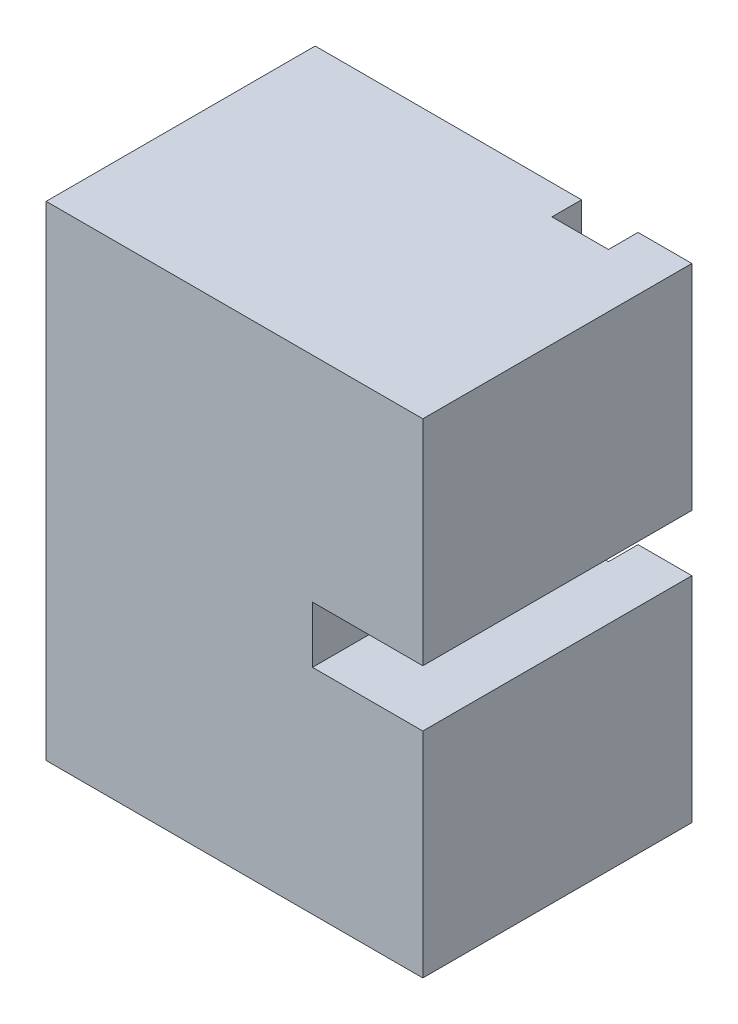
ISO-10303-21;
HEADER;
FILE_DESCRIPTION(('STEP AP214'),'2;1');
FILE_NAME('part.step','',(''),(''),'','','');
FILE_SCHEMA(('AUTOMOTIVE_DESIGN { 1 0 10303 214 1 1 1 1 }'));
ENDSEC;
DATA;
#1=APPLICATION_CONTEXT('core data for automotive mechanical design processes');
#2=APPLICATION_PROTOCOL_DEFINITION('international standard','automotive_design',2000,#1);
#3=PRODUCT_CONTEXT('',#1,'mechanical');
#4=PRODUCT('Part','Part','',(#3));
#5=PRODUCT_RELATED_PRODUCT_CATEGORY('part','',(#4));
#6=PRODUCT_DEFINITION_FORMATION('','',#4);
#7=PRODUCT_DEFINITION_CONTEXT('part definition',#1,'design');
#8=PRODUCT_DEFINITION('design','',#6,#7);
#9=PRODUCT_DEFINITION_SHAPE('','',#8);
#10=(LENGTH_UNIT() NAMED_UNIT(*) SI_UNIT(.MILLI.,.METRE.));
#11=(NAMED_UNIT(*) PLANE_ANGLE_UNIT() SI_UNIT($,.RADIAN.));
#12=(NAMED_UNIT(*) SI_UNIT($,.STERADIAN.) SOLID_ANGLE_UNIT());
#13=UNCERTAINTY_MEASURE_WITH_UNIT(LENGTH_MEASURE(1.E-05),#10,'distance_accuracy_value','');
#14=(GEOMETRIC_REPRESENTATION_CONTEXT(3) GLOBAL_UNCERTAINTY_ASSIGNED_CONTEXT((#13)) GLOBAL_UNIT_ASSIGNED_CONTEXT((#10,
#11,#12)) REPRESENTATION_CONTEXT('',''));
#15=CARTESIAN_POINT('',(0.,0.,0.));
#16=DIRECTION('',(0.,0.,1.));
#17=DIRECTION('',(1.,0.,0.));
#18=AXIS2_PLACEMENT_3D('',#15,#16,#17);
#19=CARTESIAN_POINT('',(0.,0.,50.));
#20=DIRECTION('',(0.,1.,0.));
#21=DIRECTION('',(0.,0.,1.));
#22=AXIS2_PLACEMENT_3D('',#19,#20,#21);
#23=PLANE('',#22);
#24=DIRECTION('',(0.,0.,-1.));
#25=VECTOR('',#24,1.);
#26=CARTESIAN_POINT('',(49.5,0.,50.));
#27=LINE('',#26,#25);
#28=CARTESIAN_POINT('',(49.5,0.,5.5));
#29=VERTEX_POINT('',#28);
#30=CARTESIAN_POINT('',(49.5,0.,0.));
#31=VERTEX_POINT('',#30);
#32=EDGE_CURVE('E153',#29,#31,#27,.T.);
#33=ORIENTED_EDGE('',*,*,#32,.F.);
#34=DIRECTION('',(-1.,0.,0.));
#35=VECTOR('',#34,1.);
#36=CARTESIAN_POINT('',(0.,0.,5.5));
#37=LINE('',#36,#35);
#38=CARTESIAN_POINT('',(60.,0.,5.5));
#39=VERTEX_POINT('',#38);
#40=EDGE_CURVE('E147',#39,#29,#37,.T.);
#41=ORIENTED_EDGE('',*,*,#40,.F.);
#42=DIRECTION('',(0.,0.,1.));
#43=VECTOR('',#42,1.);
#44=CARTESIAN_POINT('',(60.,0.,50.));
#45=LINE('',#44,#43);
#46=CARTESIAN_POINT('',(60.,0.,0.));
#47=VERTEX_POINT('',#46);
#48=EDGE_CURVE('E133',#47,#39,#45,.T.);
#49=ORIENTED_EDGE('',*,*,#48,.F.);
#50=DIRECTION('',(1.,0.,0.));
#51=VECTOR('',#50,1.);
#52=CARTESIAN_POINT('',(0.,0.,0.));
#53=LINE('',#52,#51);
#54=CARTESIAN_POINT('',(70.,0.,0.));
#55=VERTEX_POINT('',#54);
#56=EDGE_CURVE('E208',#47,#55,#53,.T.);
#57=ORIENTED_EDGE('',*,*,#56,.T.);
#58=DIRECTION('',(0.,0.,-1.));
#59=VECTOR('',#58,1.);
#60=CARTESIAN_POINT('',(70.,0.,50.));
#61=LINE('',#60,#59);
#62=CARTESIAN_POINT('',(70.,0.,50.));
#63=VERTEX_POINT('',#62);
#64=EDGE_CURVE('E223',#63,#55,#61,.T.);
#65=ORIENTED_EDGE('',*,*,#64,.F.);
#66=DIRECTION('',(1.,0.,0.));
#67=VECTOR('',#66,1.);
#68=CARTESIAN_POINT('',(0.,0.,50.));
#69=LINE('',#68,#67);
#70=CARTESIAN_POINT('',(0.,0.,50.));
#71=VERTEX_POINT('',#70);
#72=EDGE_CURVE('E196',#71,#63,#69,.T.);
#73=ORIENTED_EDGE('',*,*,#72,.F.);
#74=DIRECTION('',(0.,0.,-1.));
#75=VECTOR('',#74,1.);
#76=CARTESIAN_POINT('',(0.,0.,50.));
#77=LINE('',#76,#75);
#78=CARTESIAN_POINT('',(0.,0.,0.));
#79=VERTEX_POINT('',#78);
#80=EDGE_CURVE('E226',#71,#79,#77,.T.);
#81=ORIENTED_EDGE('',*,*,#80,.T.);
#82=EDGE_CURVE('E209',#79,#31,#53,.T.);
#83=ORIENTED_EDGE('',*,*,#82,.T.);
#84=EDGE_LOOP('',(#33,#41,#49,#57,#65,#73,#81,#83));
#85=FACE_BOUND('',#84,.T.);
#86=ADVANCED_FACE('F33',(#85),#23,.F.);
#87=CARTESIAN_POINT('',(0.,90.,50.));
#88=DIRECTION('',(0.,-1.,0.));
#89=DIRECTION('',(0.,0.,-1.));
#90=AXIS2_PLACEMENT_3D('',#87,#88,#89);
#91=PLANE('',#90);
#92=DIRECTION('',(0.,0.,1.));
#93=VECTOR('',#92,1.);
#94=CARTESIAN_POINT('',(49.5,90.,50.));
#95=LINE('',#94,#93);
#96=CARTESIAN_POINT('',(49.5,90.,0.));
#97=VERTEX_POINT('',#96);
#98=CARTESIAN_POINT('',(49.5,90.,5.5));
#99=VERTEX_POINT('',#98);
#100=EDGE_CURVE('E143',#97,#99,#95,.T.);
#101=ORIENTED_EDGE('',*,*,#100,.F.);
#102=DIRECTION('',(-1.,0.,0.));
#103=VECTOR('',#102,1.);
#104=CARTESIAN_POINT('',(0.,90.,0.));
#105=LINE('',#104,#103);
#106=CARTESIAN_POINT('',(0.,90.,0.));
#107=VERTEX_POINT('',#106);
#108=EDGE_CURVE('E215',#97,#107,#105,.T.);
#109=ORIENTED_EDGE('',*,*,#108,.T.);
#110=DIRECTION('',(0.,0.,-1.));
#111=VECTOR('',#110,1.);
#112=CARTESIAN_POINT('',(0.,90.,50.));
#113=LINE('',#112,#111);
#114=CARTESIAN_POINT('',(0.,90.,50.));
#115=VERTEX_POINT('',#114);
#116=EDGE_CURVE('E205',#115,#107,#113,.T.);
#117=ORIENTED_EDGE('',*,*,#116,.F.);
#118=DIRECTION('',(-1.,0.,0.));
#119=VECTOR('',#118,1.);
#120=CARTESIAN_POINT('',(0.,90.,50.));
#121=LINE('',#120,#119);
#122=CARTESIAN_POINT('',(70.,90.,50.));
#123=VERTEX_POINT('',#122);
#124=EDGE_CURVE('E203',#123,#115,#121,.T.);
#125=ORIENTED_EDGE('',*,*,#124,.F.);
#126=DIRECTION('',(0.,0.,-1.));
#127=VECTOR('',#126,1.);
#128=CARTESIAN_POINT('',(70.,90.,50.));
#129=LINE('',#128,#127);
#130=CARTESIAN_POINT('',(70.,90.,0.));
#131=VERTEX_POINT('',#130);
#132=EDGE_CURVE('E220',#123,#131,#129,.T.);
#133=ORIENTED_EDGE('',*,*,#132,.T.);
#134=CARTESIAN_POINT('',(60.,90.,0.));
#135=VERTEX_POINT('',#134);
#136=EDGE_CURVE('E197',#131,#135,#105,.T.);
#137=ORIENTED_EDGE('',*,*,#136,.T.);
#138=DIRECTION('',(0.,0.,-1.));
#139=VECTOR('',#138,1.);
#140=CARTESIAN_POINT('',(60.,90.,50.));
#141=LINE('',#140,#139);
#142=CARTESIAN_POINT('',(60.,90.,5.5));
#143=VERTEX_POINT('',#142);
#144=EDGE_CURVE('E144',#143,#135,#141,.T.);
#145=ORIENTED_EDGE('',*,*,#144,.F.);
#146=DIRECTION('',(1.,0.,0.));
#147=VECTOR('',#146,1.);
#148=CARTESIAN_POINT('',(0.,90.,5.5));
#149=LINE('',#148,#147);
#150=EDGE_CURVE('E155',#99,#143,#149,.T.);
#151=ORIENTED_EDGE('',*,*,#150,.F.);
#152=EDGE_LOOP('',(#101,#109,#117,#125,#133,#137,#145,#151));
#153=FACE_BOUND('',#152,.T.);
#154=ADVANCED_FACE('F264',(#153),#91,.F.);
#155=CARTESIAN_POINT('',(0.,0.,0.));
#156=DIRECTION('',(0.,0.,-1.));
#157=DIRECTION('',(-1.,0.,0.));
#158=AXIS2_PLACEMENT_3D('',#155,#156,#157);
#159=PLANE('',#158);
#160=ORIENTED_EDGE('',*,*,#108,.F.);
#161=DIRECTION('',(0.,1.,0.));
#162=VECTOR('',#161,1.);
#163=CARTESIAN_POINT('',(49.5,50.25,0.));
#164=LINE('',#163,#162);
#165=EDGE_CURVE('E179',#31,#97,#164,.T.);
#166=ORIENTED_EDGE('',*,*,#165,.F.);
#167=ORIENTED_EDGE('',*,*,#82,.F.);
#168=DIRECTION('',(0.,-1.,0.));
#169=VECTOR('',#168,1.);
#170=CARTESIAN_POINT('',(0.,0.,0.));
#171=LINE('',#170,#169);
#172=EDGE_CURVE('E185',#107,#79,#171,.T.);
#173=ORIENTED_EDGE('',*,*,#172,.F.);
#174=EDGE_LOOP('',(#160,#166,#167,#173));
#175=FACE_BOUND('',#174,.T.);
#176=ADVANCED_FACE('F236',(#175),#159,.T.);
#177=ORIENTED_EDGE('',*,*,#56,.F.);
#178=DIRECTION('',(0.,1.,0.));
#179=VECTOR('',#178,1.);
#180=CARTESIAN_POINT('',(60.,-9.75,0.));
#181=LINE('',#180,#179);
#182=CARTESIAN_POINT('',(60.,39.75,0.));
#183=VERTEX_POINT('',#182);
#184=EDGE_CURVE('E139',#47,#183,#181,.T.);
#185=ORIENTED_EDGE('',*,*,#184,.T.);
#186=DIRECTION('',(-1.,0.,0.));
#187=VECTOR('',#186,1.);
#188=CARTESIAN_POINT('',(70.,39.75,0.));
#189=LINE('',#188,#187);
#190=CARTESIAN_POINT('',(70.,39.75,0.));
#191=VERTEX_POINT('',#190);
#192=EDGE_CURVE('E165',#191,#183,#189,.T.);
#193=ORIENTED_EDGE('',*,*,#192,.F.);
#194=DIRECTION('',(0.,1.,0.));
#195=VECTOR('',#194,1.);
#196=CARTESIAN_POINT('',(70.,0.,0.));
#197=LINE('',#196,#195);
#198=EDGE_CURVE('E212',#55,#191,#197,.T.);
#199=ORIENTED_EDGE('',*,*,#198,.F.);
#200=EDGE_LOOP('',(#177,#185,#193,#199));
#201=FACE_BOUND('',#200,.T.);
#202=ADVANCED_FACE('F250',(#201),#159,.T.);
#203=DIRECTION('',(1.,0.,0.));
#204=VECTOR('',#203,1.);
#205=CARTESIAN_POINT('',(70.,50.25,0.));
#206=LINE('',#205,#204);
#207=CARTESIAN_POINT('',(60.,50.25,0.));
#208=VERTEX_POINT('',#207);
#209=CARTESIAN_POINT('',(70.,50.25,0.));
#210=VERTEX_POINT('',#209);
#211=EDGE_CURVE('E170',#208,#210,#206,.T.);
#212=ORIENTED_EDGE('',*,*,#211,.F.);
#213=EDGE_CURVE('E148',#208,#135,#181,.T.);
#214=ORIENTED_EDGE('',*,*,#213,.T.);
#215=ORIENTED_EDGE('',*,*,#136,.F.);
#216=EDGE_CURVE('E211',#210,#131,#197,.T.);
#217=ORIENTED_EDGE('',*,*,#216,.F.);
#218=EDGE_LOOP('',(#212,#214,#215,#217));
#219=FACE_BOUND('',#218,.T.);
#220=ADVANCED_FACE('F275',(#219),#159,.T.);
#221=CARTESIAN_POINT('',(70.,50.25,50.));
#222=DIRECTION('',(0.,1.,0.));
#223=DIRECTION('',(0.,0.,1.));
#224=AXIS2_PLACEMENT_3D('',#221,#222,#223);
#225=PLANE('',#224);
#226=DIRECTION('',(0.,0.,1.));
#227=VECTOR('',#226,1.);
#228=CARTESIAN_POINT('',(60.,50.25,50.));
#229=LINE('',#228,#227);
#230=CARTESIAN_POINT('',(60.,50.25,5.5));
#231=VERTEX_POINT('',#230);
#232=EDGE_CURVE('E154',#208,#231,#229,.T.);
#233=ORIENTED_EDGE('',*,*,#232,.F.);
#234=ORIENTED_EDGE('',*,*,#211,.T.);
#235=DIRECTION('',(0.,0.,-1.));
#236=VECTOR('',#235,1.);
#237=CARTESIAN_POINT('',(70.,50.25,50.));
#238=LINE('',#237,#236);
#239=CARTESIAN_POINT('',(70.,50.25,50.));
#240=VERTEX_POINT('',#239);
#241=EDGE_CURVE('E182',#240,#210,#238,.T.);
#242=ORIENTED_EDGE('',*,*,#241,.F.);
#243=DIRECTION('',(1.,0.,0.));
#244=VECTOR('',#243,1.);
#245=CARTESIAN_POINT('',(70.,50.25,50.));
#246=LINE('',#245,#244);
#247=CARTESIAN_POINT('',(49.5,50.25,50.));
#248=VERTEX_POINT('',#247);
#249=EDGE_CURVE('E173',#248,#240,#246,.T.);
#250=ORIENTED_EDGE('',*,*,#249,.F.);
#251=DIRECTION('',(0.,0.,-1.));
#252=VECTOR('',#251,1.);
#253=CARTESIAN_POINT('',(49.5,50.25,50.));
#254=LINE('',#253,#252);
#255=CARTESIAN_POINT('',(49.5,50.25,5.5));
#256=VERTEX_POINT('',#255);
#257=EDGE_CURVE('E186',#248,#256,#254,.T.);
#258=ORIENTED_EDGE('',*,*,#257,.T.);
#259=DIRECTION('',(-1.,0.,0.));
#260=VECTOR('',#259,1.);
#261=CARTESIAN_POINT('',(70.,50.25,5.5));
#262=LINE('',#261,#260);
#263=EDGE_CURVE('E158',#231,#256,#262,.T.);
#264=ORIENTED_EDGE('',*,*,#263,.F.);
#265=EDGE_LOOP('',(#233,#234,#242,#250,#258,#264));
#266=FACE_BOUND('',#265,.T.);
#267=ADVANCED_FACE('F277',(#266),#225,.F.);
#268=CARTESIAN_POINT('',(70.,39.75,50.));
#269=DIRECTION('',(0.,-1.,0.));
#270=DIRECTION('',(0.,0.,-1.));
#271=AXIS2_PLACEMENT_3D('',#268,#269,#270);
#272=PLANE('',#271);
#273=DIRECTION('',(0.,0.,-1.));
#274=VECTOR('',#273,1.);
#275=CARTESIAN_POINT('',(60.,39.75,50.));
#276=LINE('',#275,#274);
#277=CARTESIAN_POINT('',(60.,39.75,5.5));
#278=VERTEX_POINT('',#277);
#279=EDGE_CURVE('E11',#278,#183,#276,.T.);
#280=ORIENTED_EDGE('',*,*,#279,.F.);
#281=DIRECTION('',(1.,0.,0.));
#282=VECTOR('',#281,1.);
#283=CARTESIAN_POINT('',(70.,39.75,5.5));
#284=LINE('',#283,#282);
#285=CARTESIAN_POINT('',(49.5,39.75,5.5));
#286=VERTEX_POINT('',#285);
#287=EDGE_CURVE('E41',#286,#278,#284,.T.);
#288=ORIENTED_EDGE('',*,*,#287,.F.);
#289=DIRECTION('',(0.,0.,-1.));
#290=VECTOR('',#289,1.);
#291=CARTESIAN_POINT('',(49.5,39.75,50.));
#292=LINE('',#291,#290);
#293=CARTESIAN_POINT('',(49.5,39.75,50.));
#294=VERTEX_POINT('',#293);
#295=EDGE_CURVE('E189',#294,#286,#292,.T.);
#296=ORIENTED_EDGE('',*,*,#295,.F.);
#297=DIRECTION('',(-1.,0.,0.));
#298=VECTOR('',#297,1.);
#299=CARTESIAN_POINT('',(70.,39.75,50.));
#300=LINE('',#299,#298);
#301=CARTESIAN_POINT('',(70.,39.75,50.));
#302=VERTEX_POINT('',#301);
#303=EDGE_CURVE('E166',#302,#294,#300,.T.);
#304=ORIENTED_EDGE('',*,*,#303,.F.);
#305=DIRECTION('',(0.,0.,-1.));
#306=VECTOR('',#305,1.);
#307=CARTESIAN_POINT('',(70.,39.75,50.));
#308=LINE('',#307,#306);
#309=EDGE_CURVE('E176',#302,#191,#308,.T.);
#310=ORIENTED_EDGE('',*,*,#309,.T.);
#311=ORIENTED_EDGE('',*,*,#192,.T.);
#312=EDGE_LOOP('',(#280,#288,#296,#304,#310,#311));
#313=FACE_BOUND('',#312,.T.);
#314=ADVANCED_FACE('F253',(#313),#272,.F.);
#315=CARTESIAN_POINT('',(70.,0.,50.));
#316=DIRECTION('',(-1.,0.,0.));
#317=DIRECTION('',(0.,0.,1.));
#318=AXIS2_PLACEMENT_3D('',#315,#316,#317);
#319=PLANE('',#318);
#320=DIRECTION('',(0.,1.,0.));
#321=VECTOR('',#320,1.);
#322=CARTESIAN_POINT('',(70.,0.,50.));
#323=LINE('',#322,#321);
#324=EDGE_CURVE('E199',#240,#123,#323,.T.);
#325=ORIENTED_EDGE('',*,*,#324,.F.);
#326=ORIENTED_EDGE('',*,*,#241,.T.);
#327=ORIENTED_EDGE('',*,*,#216,.T.);
#328=ORIENTED_EDGE('',*,*,#132,.F.);
#329=EDGE_LOOP('',(#325,#326,#327,#328));
#330=FACE_BOUND('',#329,.T.);
#331=ADVANCED_FACE('F280',(#330),#319,.F.);
#332=CARTESIAN_POINT('',(0.,0.,50.));
#333=DIRECTION('',(1.,0.,0.));
#334=DIRECTION('',(0.,0.,-1.));
#335=AXIS2_PLACEMENT_3D('',#332,#333,#334);
#336=PLANE('',#335);
#337=ORIENTED_EDGE('',*,*,#172,.T.);
#338=ORIENTED_EDGE('',*,*,#80,.F.);
#339=DIRECTION('',(0.,-1.,0.));
#340=VECTOR('',#339,1.);
#341=CARTESIAN_POINT('',(0.,0.,50.));
#342=LINE('',#341,#340);
#343=EDGE_CURVE('E193',#115,#71,#342,.T.);
#344=ORIENTED_EDGE('',*,*,#343,.F.);
#345=ORIENTED_EDGE('',*,*,#116,.T.);
#346=EDGE_LOOP('',(#337,#338,#344,#345));
#347=FACE_BOUND('',#346,.T.);
#348=ADVANCED_FACE('F35',(#347),#336,.F.);
#349=ORIENTED_EDGE('',*,*,#198,.T.);
#350=ORIENTED_EDGE('',*,*,#309,.F.);
#351=EDGE_CURVE('E200',#63,#302,#323,.T.);
#352=ORIENTED_EDGE('',*,*,#351,.F.);
#353=ORIENTED_EDGE('',*,*,#64,.T.);
#354=EDGE_LOOP('',(#349,#350,#352,#353));
#355=FACE_BOUND('',#354,.T.);
#356=ADVANCED_FACE('F257',(#355),#319,.F.);
#357=CARTESIAN_POINT('',(0.,0.,50.));
#358=DIRECTION('',(0.,0.,-1.));
#359=DIRECTION('',(-1.,0.,0.));
#360=AXIS2_PLACEMENT_3D('',#357,#358,#359);
#361=PLANE('',#360);
#362=DIRECTION('',(0.,1.,0.));
#363=VECTOR('',#362,1.);
#364=CARTESIAN_POINT('',(49.5,50.25,50.));
#365=LINE('',#364,#363);
#366=EDGE_CURVE('E169',#294,#248,#365,.T.);
#367=ORIENTED_EDGE('',*,*,#366,.T.);
#368=ORIENTED_EDGE('',*,*,#249,.T.);
#369=ORIENTED_EDGE('',*,*,#324,.T.);
#370=ORIENTED_EDGE('',*,*,#124,.T.);
#371=ORIENTED_EDGE('',*,*,#343,.T.);
#372=ORIENTED_EDGE('',*,*,#72,.T.);
#373=ORIENTED_EDGE('',*,*,#351,.T.);
#374=ORIENTED_EDGE('',*,*,#303,.T.);
#375=EDGE_LOOP('',(#367,#368,#369,#370,#371,#372,#373,#374));
#376=FACE_BOUND('',#375,.T.);
#377=ADVANCED_FACE('F259',(#376),#361,.F.);
#378=CARTESIAN_POINT('',(49.5,50.25,50.));
#379=DIRECTION('',(-1.,0.,0.));
#380=DIRECTION('',(0.,0.,1.));
#381=AXIS2_PLACEMENT_3D('',#378,#379,#380);
#382=PLANE('',#381);
#383=ORIENTED_EDGE('',*,*,#165,.T.);
#384=ORIENTED_EDGE('',*,*,#100,.T.);
#385=DIRECTION('',(0.,1.,0.));
#386=VECTOR('',#385,1.);
#387=CARTESIAN_POINT('',(49.5,-9.75,5.5));
#388=LINE('',#387,#386);
#389=EDGE_CURVE('E241',#256,#99,#388,.T.);
#390=ORIENTED_EDGE('',*,*,#389,.F.);
#391=ORIENTED_EDGE('',*,*,#257,.F.);
#392=ORIENTED_EDGE('',*,*,#366,.F.);
#393=ORIENTED_EDGE('',*,*,#295,.T.);
#394=EDGE_CURVE('E56',#29,#286,#388,.T.);
#395=ORIENTED_EDGE('',*,*,#394,.F.);
#396=ORIENTED_EDGE('',*,*,#32,.T.);
#397=EDGE_LOOP('',(#383,#384,#390,#391,#392,#393,#395,#396));
#398=FACE_BOUND('',#397,.T.);
#399=ADVANCED_FACE('F239',(#398),#382,.F.);
#400=CARTESIAN_POINT('',(49.5,-9.75,5.5));
#401=DIRECTION('',(0.,0.,-1.));
#402=DIRECTION('',(-1.,0.,0.));
#403=AXIS2_PLACEMENT_3D('',#400,#401,#402);
#404=PLANE('',#403);
#405=ORIENTED_EDGE('',*,*,#40,.T.);
#406=ORIENTED_EDGE('',*,*,#394,.T.);
#407=ORIENTED_EDGE('',*,*,#287,.T.);
#408=DIRECTION('',(0.,1.,0.));
#409=VECTOR('',#408,1.);
#410=CARTESIAN_POINT('',(60.,-9.75,5.5));
#411=LINE('',#410,#409);
#412=EDGE_CURVE('E136',#39,#278,#411,.T.);
#413=ORIENTED_EDGE('',*,*,#412,.F.);
#414=EDGE_LOOP('',(#405,#406,#407,#413));
#415=FACE_BOUND('',#414,.T.);
#416=ADVANCED_FACE('F146',(#415),#404,.T.);
#417=CARTESIAN_POINT('',(60.,-9.75,0.));
#418=DIRECTION('',(-1.,0.,0.));
#419=DIRECTION('',(0.,0.,1.));
#420=AXIS2_PLACEMENT_3D('',#417,#418,#419);
#421=PLANE('',#420);
#422=ORIENTED_EDGE('',*,*,#48,.T.);
#423=ORIENTED_EDGE('',*,*,#412,.T.);
#424=ORIENTED_EDGE('',*,*,#279,.T.);
#425=ORIENTED_EDGE('',*,*,#184,.F.);
#426=EDGE_LOOP('',(#422,#423,#424,#425));
#427=FACE_BOUND('',#426,.T.);
#428=ADVANCED_FACE('F135',(#427),#421,.T.);
#429=ORIENTED_EDGE('',*,*,#144,.T.);
#430=ORIENTED_EDGE('',*,*,#213,.F.);
#431=ORIENTED_EDGE('',*,*,#232,.T.);
#432=EDGE_CURVE('E48',#231,#143,#411,.T.);
#433=ORIENTED_EDGE('',*,*,#432,.T.);
#434=EDGE_LOOP('',(#429,#430,#431,#433));
#435=FACE_BOUND('',#434,.T.);
#436=ADVANCED_FACE('F269',(#435),#421,.T.);
#437=ORIENTED_EDGE('',*,*,#150,.T.);
#438=ORIENTED_EDGE('',*,*,#432,.F.);
#439=ORIENTED_EDGE('',*,*,#263,.T.);
#440=ORIENTED_EDGE('',*,*,#389,.T.);
#441=EDGE_LOOP('',(#437,#438,#439,#440));
#442=FACE_BOUND('',#441,.T.);
#443=ADVANCED_FACE('F267',(#442),#404,.T.);
#444=CLOSED_SHELL('',(#86,#154,#176,#202,#220,#267,#314,#331,#348,#356,#377,#399,#416,#428,#436,#443));
#445=MANIFOLD_SOLID_BREP('B2',#444);
#446=ADVANCED_BREP_SHAPE_REPRESENTATION('',(#18,#445),#14);
#447=SHAPE_DEFINITION_REPRESENTATION(#9,#446);
ENDSEC;
END-ISO-10303-21;
